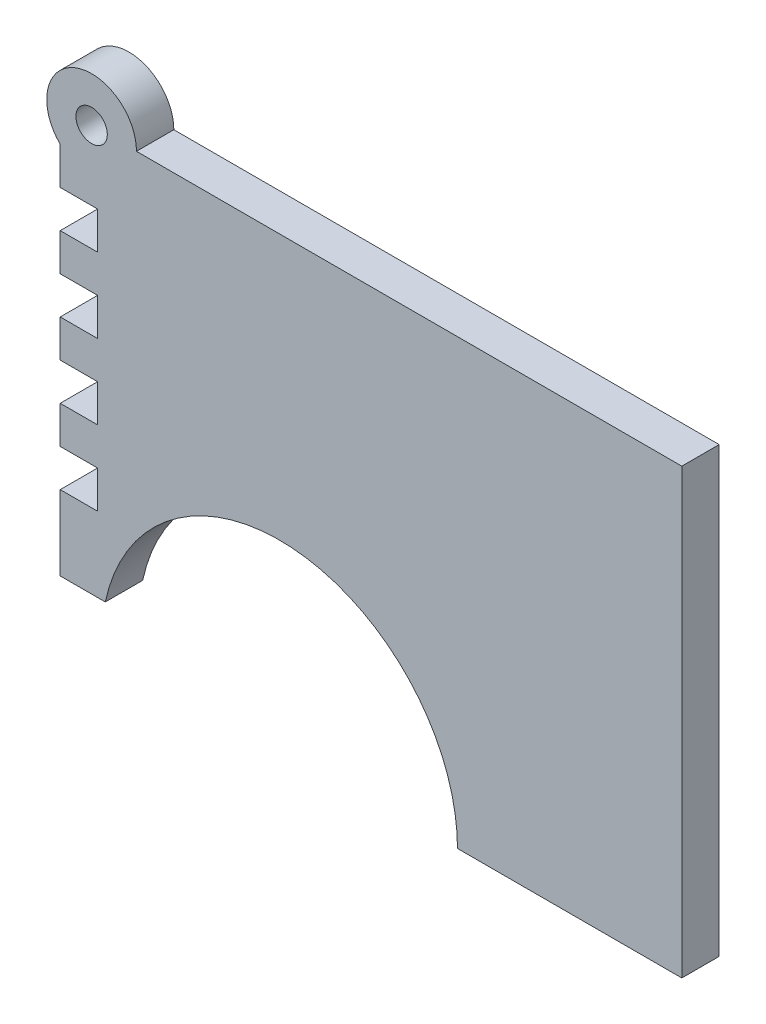
ISO-10303-21;
HEADER;
FILE_DESCRIPTION(('STEP AP214'),'2;1');
FILE_NAME('part.step','',(''),(''),'','','');
FILE_SCHEMA(('AUTOMOTIVE_DESIGN { 1 0 10303 214 1 1 1 1 }'));
ENDSEC;
DATA;
#1=APPLICATION_CONTEXT('core data for automotive mechanical design processes');
#2=APPLICATION_PROTOCOL_DEFINITION('international standard','automotive_design',2000,#1);
#3=PRODUCT_CONTEXT('',#1,'mechanical');
#4=PRODUCT('Part','Part','',(#3));
#5=PRODUCT_RELATED_PRODUCT_CATEGORY('part','',(#4));
#6=PRODUCT_DEFINITION_FORMATION('','',#4);
#7=PRODUCT_DEFINITION_CONTEXT('part definition',#1,'design');
#8=PRODUCT_DEFINITION('design','',#6,#7);
#9=PRODUCT_DEFINITION_SHAPE('','',#8);
#10=(LENGTH_UNIT() NAMED_UNIT(*) SI_UNIT(.MILLI.,.METRE.));
#11=(NAMED_UNIT(*) PLANE_ANGLE_UNIT() SI_UNIT($,.RADIAN.));
#12=(NAMED_UNIT(*) SI_UNIT($,.STERADIAN.) SOLID_ANGLE_UNIT());
#13=UNCERTAINTY_MEASURE_WITH_UNIT(LENGTH_MEASURE(1.E-05),#10,'distance_accuracy_value','');
#14=(GEOMETRIC_REPRESENTATION_CONTEXT(3) GLOBAL_UNCERTAINTY_ASSIGNED_CONTEXT((#13)) GLOBAL_UNIT_ASSIGNED_CONTEXT((#10,
#11,#12)) REPRESENTATION_CONTEXT('',''));
#15=CARTESIAN_POINT('',(0.,0.,0.));
#16=DIRECTION('',(0.,0.,1.));
#17=DIRECTION('',(1.,0.,0.));
#18=AXIS2_PLACEMENT_3D('',#15,#16,#17);
#19=CARTESIAN_POINT('',(-78.9358833827366,28.1282330178117,5.));
#20=DIRECTION('',(0.,0.,1.));
#21=DIRECTION('',(1.,0.,0.));
#22=AXIS2_PLACEMENT_3D('',#19,#20,#21);
#23=PLANE('',#22);
#24=CARTESIAN_POINT('',(-78.9358833827366,28.1282330178117,5.));
#25=DIRECTION('',(0.,0.,1.));
#26=DIRECTION('',(1.,0.,0.));
#27=AXIS2_PLACEMENT_3D('',#24,#25,#26);
#28=CIRCLE('',#27,5.99999999999999);
#29=CARTESIAN_POINT('',(-72.9358833827366,28.1282330178121,5.));
#30=VERTEX_POINT('',#29);
#31=CARTESIAN_POINT('',(-83.1358833827366,23.8433759606861,5.));
#32=VERTEX_POINT('',#31);
#33=EDGE_CURVE('E52',#30,#32,#28,.T.);
#34=ORIENTED_EDGE('',*,*,#33,.T.);
#35=DIRECTION('',(0.,-1.,0.));
#36=VECTOR('',#35,1.);
#37=CARTESIAN_POINT('',(-83.1358833827366,23.8433759606861,5.));
#38=LINE('',#37,#36);
#39=CARTESIAN_POINT('',(-83.1358833827366,18.842375860666,5.));
#40=VERTEX_POINT('',#39);
#41=EDGE_CURVE('E140',#32,#40,#38,.T.);
#42=ORIENTED_EDGE('',*,*,#41,.T.);
#43=DIRECTION('',(1.,0.,0.));
#44=VECTOR('',#43,1.);
#45=CARTESIAN_POINT('',(-78.1358833827366,18.842375860666,5.));
#46=LINE('',#45,#44);
#47=CARTESIAN_POINT('',(-78.1358833827366,18.842375860666,5.));
#48=VERTEX_POINT('',#47);
#49=EDGE_CURVE('E329',#40,#48,#46,.T.);
#50=ORIENTED_EDGE('',*,*,#49,.T.);
#51=DIRECTION('',(0.,-1.,0.));
#52=VECTOR('',#51,1.);
#53=CARTESIAN_POINT('',(-78.1358833827366,13.842375860666,5.));
#54=LINE('',#53,#52);
#55=CARTESIAN_POINT('',(-78.1358833827366,13.842375860666,5.));
#56=VERTEX_POINT('',#55);
#57=EDGE_CURVE('E349',#48,#56,#54,.T.);
#58=ORIENTED_EDGE('',*,*,#57,.T.);
#59=DIRECTION('',(-1.,0.,0.));
#60=VECTOR('',#59,1.);
#61=CARTESIAN_POINT('',(-83.1358833827367,13.842375860666,5.));
#62=LINE('',#61,#60);
#63=CARTESIAN_POINT('',(-83.1358833827367,13.842375860666,5.));
#64=VERTEX_POINT('',#63);
#65=EDGE_CURVE('E346',#56,#64,#62,.T.);
#66=ORIENTED_EDGE('',*,*,#65,.T.);
#67=DIRECTION('',(0.,-1.,0.));
#68=VECTOR('',#67,1.);
#69=CARTESIAN_POINT('',(-83.1358833827367,8.842375860666,5.));
#70=LINE('',#69,#68);
#71=CARTESIAN_POINT('',(-83.1358833827367,8.842375860666,5.));
#72=VERTEX_POINT('',#71);
#73=EDGE_CURVE('E348',#64,#72,#70,.T.);
#74=ORIENTED_EDGE('',*,*,#73,.T.);
#75=DIRECTION('',(1.,0.,0.));
#76=VECTOR('',#75,1.);
#77=CARTESIAN_POINT('',(-78.1358833827367,8.842375860666,5.));
#78=LINE('',#77,#76);
#79=CARTESIAN_POINT('',(-78.1358833827367,8.842375860666,5.));
#80=VERTEX_POINT('',#79);
#81=EDGE_CURVE('E351',#72,#80,#78,.T.);
#82=ORIENTED_EDGE('',*,*,#81,.T.);
#83=DIRECTION('',(0.,-1.,0.));
#84=VECTOR('',#83,1.);
#85=CARTESIAN_POINT('',(-78.1358833827367,3.842375860666,5.));
#86=LINE('',#85,#84);
#87=CARTESIAN_POINT('',(-78.1358833827367,3.842375860666,5.));
#88=VERTEX_POINT('',#87);
#89=EDGE_CURVE('E357',#80,#88,#86,.T.);
#90=ORIENTED_EDGE('',*,*,#89,.T.);
#91=DIRECTION('',(-1.,0.,0.));
#92=VECTOR('',#91,1.);
#93=CARTESIAN_POINT('',(-83.1358833827367,3.842375860666,5.));
#94=LINE('',#93,#92);
#95=CARTESIAN_POINT('',(-83.1358833827367,3.842375860666,5.));
#96=VERTEX_POINT('',#95);
#97=EDGE_CURVE('E359',#88,#96,#94,.T.);
#98=ORIENTED_EDGE('',*,*,#97,.T.);
#99=DIRECTION('',(0.,-1.,0.));
#100=VECTOR('',#99,1.);
#101=CARTESIAN_POINT('',(-83.1358833827367,-1.157624139334,5.));
#102=LINE('',#101,#100);
#103=CARTESIAN_POINT('',(-83.1358833827367,-1.157624139334,5.));
#104=VERTEX_POINT('',#103);
#105=EDGE_CURVE('E361',#96,#104,#102,.T.);
#106=ORIENTED_EDGE('',*,*,#105,.T.);
#107=DIRECTION('',(1.,0.,0.));
#108=VECTOR('',#107,1.);
#109=CARTESIAN_POINT('',(-78.1358833827367,-1.157624139334,5.));
#110=LINE('',#109,#108);
#111=CARTESIAN_POINT('',(-78.1358833827367,-1.157624139334,5.));
#112=VERTEX_POINT('',#111);
#113=EDGE_CURVE('E363',#104,#112,#110,.T.);
#114=ORIENTED_EDGE('',*,*,#113,.T.);
#115=DIRECTION('',(0.,-1.,0.));
#116=VECTOR('',#115,1.);
#117=CARTESIAN_POINT('',(-78.1358833827367,-1.157624139334,5.));
#118=LINE('',#117,#116);
#119=CARTESIAN_POINT('',(-78.1358833827367,-6.157624139334,5.));
#120=VERTEX_POINT('',#119);
#121=EDGE_CURVE('E365',#112,#120,#118,.T.);
#122=ORIENTED_EDGE('',*,*,#121,.T.);
#123=DIRECTION('',(-1.,0.,0.));
#124=VECTOR('',#123,1.);
#125=CARTESIAN_POINT('',(-83.1358833827367,-6.15762413933399,5.));
#126=LINE('',#125,#124);
#127=CARTESIAN_POINT('',(-83.1358833827367,-6.15762413933399,5.));
#128=VERTEX_POINT('',#127);
#129=EDGE_CURVE('E367',#120,#128,#126,.T.);
#130=ORIENTED_EDGE('',*,*,#129,.T.);
#131=DIRECTION('',(0.,-1.,0.));
#132=VECTOR('',#131,1.);
#133=CARTESIAN_POINT('',(-83.1358833827367,-6.15762413933399,5.));
#134=LINE('',#133,#132);
#135=CARTESIAN_POINT('',(-83.1358833827366,-11.157624139334,5.));
#136=VERTEX_POINT('',#135);
#137=EDGE_CURVE('E369',#128,#136,#134,.T.);
#138=ORIENTED_EDGE('',*,*,#137,.T.);
#139=DIRECTION('',(1.,0.,0.));
#140=VECTOR('',#139,1.);
#141=CARTESIAN_POINT('',(-83.1358833827366,-11.157624139334,5.));
#142=LINE('',#141,#140);
#143=CARTESIAN_POINT('',(-78.1358833827366,-11.157624139334,5.));
#144=VERTEX_POINT('',#143);
#145=EDGE_CURVE('E371',#136,#144,#142,.T.);
#146=ORIENTED_EDGE('',*,*,#145,.T.);
#147=DIRECTION('',(0.,-1.,0.));
#148=VECTOR('',#147,1.);
#149=CARTESIAN_POINT('',(-78.1358833827366,-11.157624139334,5.));
#150=LINE('',#149,#148);
#151=CARTESIAN_POINT('',(-78.1358833827366,-16.157624139334,5.));
#152=VERTEX_POINT('',#151);
#153=EDGE_CURVE('E373',#144,#152,#150,.T.);
#154=ORIENTED_EDGE('',*,*,#153,.T.);
#155=DIRECTION('',(-1.,0.,0.));
#156=VECTOR('',#155,1.);
#157=CARTESIAN_POINT('',(-78.1358833827366,-16.157624139334,5.));
#158=LINE('',#157,#156);
#159=CARTESIAN_POINT('',(-83.1358833827366,-16.157624139334,5.));
#160=VERTEX_POINT('',#159);
#161=EDGE_CURVE('E375',#152,#160,#158,.T.);
#162=ORIENTED_EDGE('',*,*,#161,.T.);
#163=DIRECTION('',(0.,-1.,0.));
#164=VECTOR('',#163,1.);
#165=CARTESIAN_POINT('',(-83.1358833827366,-16.157624139334,5.));
#166=LINE('',#165,#164);
#167=CARTESIAN_POINT('',(-83.1358833827366,-26.1576241393341,5.));
#168=VERTEX_POINT('',#167);
#169=EDGE_CURVE('E377',#160,#168,#166,.T.);
#170=ORIENTED_EDGE('',*,*,#169,.T.);
#171=DIRECTION('',(1.,0.,0.));
#172=VECTOR('',#171,1.);
#173=CARTESIAN_POINT('',(-77.1051559174905,-26.1576241393341,5.));
#174=LINE('',#173,#172);
#175=CARTESIAN_POINT('',(-77.1051559174905,-26.1576241393341,5.));
#176=VERTEX_POINT('',#175);
#177=EDGE_CURVE('E379',#168,#176,#174,.T.);
#178=ORIENTED_EDGE('',*,*,#177,.T.);
#179=CARTESIAN_POINT('',(-53.8179416913671,-31.157624139334,5.));
#180=DIRECTION('',(0.,0.,-1.));
#181=DIRECTION('',(1.,0.,0.));
#182=AXIS2_PLACEMENT_3D('',#179,#180,#181);
#183=CIRCLE('',#182,23.8179416913671);
#184=CARTESIAN_POINT('',(-30.,-31.157624139334,5.));
#185=VERTEX_POINT('',#184);
#186=EDGE_CURVE('E205',#176,#185,#183,.T.);
#187=ORIENTED_EDGE('',*,*,#186,.T.);
#188=DIRECTION('',(1.,0.,0.));
#189=VECTOR('',#188,1.);
#190=CARTESIAN_POINT('',(0.,-31.157624139334,5.));
#191=LINE('',#190,#189);
#192=CARTESIAN_POINT('',(0.,-31.157624139334,5.));
#193=VERTEX_POINT('',#192);
#194=EDGE_CURVE('E199',#185,#193,#191,.T.);
#195=ORIENTED_EDGE('',*,*,#194,.T.);
#196=DIRECTION('',(0.,1.,0.));
#197=VECTOR('',#196,1.);
#198=CARTESIAN_POINT('',(0.,13.842375860666,5.));
#199=LINE('',#198,#197);
#200=CARTESIAN_POINT('',(0.,28.128233017812,5.));
#201=VERTEX_POINT('',#200);
#202=EDGE_CURVE('E203',#193,#201,#199,.T.);
#203=ORIENTED_EDGE('',*,*,#202,.T.);
#204=DIRECTION('',(-1.,0.,0.));
#205=VECTOR('',#204,1.);
#206=CARTESIAN_POINT('',(0.,28.128233017812,5.));
#207=LINE('',#206,#205);
#208=EDGE_CURVE('E220',#201,#30,#207,.T.);
#209=ORIENTED_EDGE('',*,*,#208,.T.);
#210=EDGE_LOOP('',(#34,#42,#50,#58,#66,#74,#82,#90,#98,#106,#114,#122,#130,#138,#146,#154,#162,
#170,#178,#187,#195,#203,#209));
#211=FACE_BOUND('',#210,.T.);
#212=CARTESIAN_POINT('',(-78.9358833827366,28.1282330178117,5.));
#213=DIRECTION('',(0.,0.,1.));
#214=DIRECTION('',(1.,0.,0.));
#215=AXIS2_PLACEMENT_3D('',#212,#213,#214);
#216=CIRCLE('',#215,2.09999999999999);
#217=CARTESIAN_POINT('',(-76.8358833827366,28.1282330178117,5.));
#218=VERTEX_POINT('',#217);
#219=EDGE_CURVE('E229',#218,#218,#216,.T.);
#220=ORIENTED_EDGE('',*,*,#219,.F.);
#221=EDGE_LOOP('',(#220));
#222=FACE_BOUND('',#221,.T.);
#223=ADVANCED_FACE('F35',(#211,#222),#23,.T.);
#224=CARTESIAN_POINT('',(-78.9358833827366,28.1282330178117,0.));
#225=DIRECTION('',(0.,0.,1.));
#226=DIRECTION('',(1.,0.,0.));
#227=AXIS2_PLACEMENT_3D('',#224,#225,#226);
#228=PLANE('',#227);
#229=DIRECTION('',(0.,-1.,0.));
#230=VECTOR('',#229,1.);
#231=CARTESIAN_POINT('',(-83.1358833827366,23.8433759606861,0.));
#232=LINE('',#231,#230);
#233=CARTESIAN_POINT('',(-83.1358833827366,23.8433759606861,0.));
#234=VERTEX_POINT('',#233);
#235=CARTESIAN_POINT('',(-83.1358833827366,18.842375860666,0.));
#236=VERTEX_POINT('',#235);
#237=EDGE_CURVE('E226',#234,#236,#232,.T.);
#238=ORIENTED_EDGE('',*,*,#237,.F.);
#239=CARTESIAN_POINT('',(-78.9358833827366,28.1282330178117,0.));
#240=DIRECTION('',(0.,0.,1.));
#241=DIRECTION('',(1.,0.,0.));
#242=AXIS2_PLACEMENT_3D('',#239,#240,#241);
#243=CIRCLE('',#242,6.);
#244=CARTESIAN_POINT('',(-72.9358833827366,28.1282330178121,0.));
#245=VERTEX_POINT('',#244);
#246=EDGE_CURVE('E268',#245,#234,#243,.T.);
#247=ORIENTED_EDGE('',*,*,#246,.F.);
#248=DIRECTION('',(-1.,0.,0.));
#249=VECTOR('',#248,1.);
#250=CARTESIAN_POINT('',(0.,28.128233017812,0.));
#251=LINE('',#250,#249);
#252=CARTESIAN_POINT('',(0.,28.128233017812,0.));
#253=VERTEX_POINT('',#252);
#254=EDGE_CURVE('E133',#253,#245,#251,.T.);
#255=ORIENTED_EDGE('',*,*,#254,.F.);
#256=DIRECTION('',(0.,1.,0.));
#257=VECTOR('',#256,1.);
#258=CARTESIAN_POINT('',(0.,13.842375860666,0.));
#259=LINE('',#258,#257);
#260=CARTESIAN_POINT('',(0.,-31.157624139334,0.));
#261=VERTEX_POINT('',#260);
#262=EDGE_CURVE('E126',#261,#253,#259,.T.);
#263=ORIENTED_EDGE('',*,*,#262,.F.);
#264=DIRECTION('',(1.,0.,0.));
#265=VECTOR('',#264,1.);
#266=CARTESIAN_POINT('',(0.,-31.157624139334,0.));
#267=LINE('',#266,#265);
#268=CARTESIAN_POINT('',(-30.,-31.157624139334,0.));
#269=VERTEX_POINT('',#268);
#270=EDGE_CURVE('E214',#269,#261,#267,.T.);
#271=ORIENTED_EDGE('',*,*,#270,.F.);
#272=CARTESIAN_POINT('',(-53.8179416913671,-31.157624139334,0.));
#273=DIRECTION('',(0.,0.,-1.));
#274=DIRECTION('',(1.,0.,0.));
#275=AXIS2_PLACEMENT_3D('',#272,#273,#274);
#276=CIRCLE('',#275,23.8179416913671);
#277=CARTESIAN_POINT('',(-77.1051559174905,-26.1576241393341,0.));
#278=VERTEX_POINT('',#277);
#279=EDGE_CURVE('E263',#278,#269,#276,.T.);
#280=ORIENTED_EDGE('',*,*,#279,.F.);
#281=DIRECTION('',(1.,0.,0.));
#282=VECTOR('',#281,1.);
#283=CARTESIAN_POINT('',(-77.1051559174905,-26.1576241393341,0.));
#284=LINE('',#283,#282);
#285=CARTESIAN_POINT('',(-83.1358833827366,-26.1576241393341,0.));
#286=VERTEX_POINT('',#285);
#287=EDGE_CURVE('E261',#286,#278,#284,.T.);
#288=ORIENTED_EDGE('',*,*,#287,.F.);
#289=DIRECTION('',(0.,-1.,0.));
#290=VECTOR('',#289,1.);
#291=CARTESIAN_POINT('',(-83.1358833827366,-16.157624139334,0.));
#292=LINE('',#291,#290);
#293=CARTESIAN_POINT('',(-83.1358833827366,-16.157624139334,0.));
#294=VERTEX_POINT('',#293);
#295=EDGE_CURVE('E259',#294,#286,#292,.T.);
#296=ORIENTED_EDGE('',*,*,#295,.F.);
#297=DIRECTION('',(-1.,0.,0.));
#298=VECTOR('',#297,1.);
#299=CARTESIAN_POINT('',(-78.1358833827366,-16.157624139334,0.));
#300=LINE('',#299,#298);
#301=CARTESIAN_POINT('',(-78.1358833827366,-16.157624139334,0.));
#302=VERTEX_POINT('',#301);
#303=EDGE_CURVE('E257',#302,#294,#300,.T.);
#304=ORIENTED_EDGE('',*,*,#303,.F.);
#305=DIRECTION('',(0.,-1.,0.));
#306=VECTOR('',#305,1.);
#307=CARTESIAN_POINT('',(-78.1358833827366,-11.157624139334,0.));
#308=LINE('',#307,#306);
#309=CARTESIAN_POINT('',(-78.1358833827366,-11.157624139334,0.));
#310=VERTEX_POINT('',#309);
#311=EDGE_CURVE('E255',#310,#302,#308,.T.);
#312=ORIENTED_EDGE('',*,*,#311,.F.);
#313=DIRECTION('',(1.,0.,0.));
#314=VECTOR('',#313,1.);
#315=CARTESIAN_POINT('',(-83.1358833827366,-11.157624139334,0.));
#316=LINE('',#315,#314);
#317=CARTESIAN_POINT('',(-83.1358833827366,-11.157624139334,0.));
#318=VERTEX_POINT('',#317);
#319=EDGE_CURVE('E253',#318,#310,#316,.T.);
#320=ORIENTED_EDGE('',*,*,#319,.F.);
#321=DIRECTION('',(0.,-1.,0.));
#322=VECTOR('',#321,1.);
#323=CARTESIAN_POINT('',(-83.1358833827367,-6.15762413933399,0.));
#324=LINE('',#323,#322);
#325=CARTESIAN_POINT('',(-83.1358833827367,-6.15762413933399,0.));
#326=VERTEX_POINT('',#325);
#327=EDGE_CURVE('E251',#326,#318,#324,.T.);
#328=ORIENTED_EDGE('',*,*,#327,.F.);
#329=DIRECTION('',(-1.,0.,0.));
#330=VECTOR('',#329,1.);
#331=CARTESIAN_POINT('',(-83.1358833827367,-6.15762413933399,0.));
#332=LINE('',#331,#330);
#333=CARTESIAN_POINT('',(-78.1358833827367,-6.157624139334,0.));
#334=VERTEX_POINT('',#333);
#335=EDGE_CURVE('E249',#334,#326,#332,.T.);
#336=ORIENTED_EDGE('',*,*,#335,.F.);
#337=DIRECTION('',(0.,-1.,0.));
#338=VECTOR('',#337,1.);
#339=CARTESIAN_POINT('',(-78.1358833827367,-1.157624139334,0.));
#340=LINE('',#339,#338);
#341=CARTESIAN_POINT('',(-78.1358833827367,-1.157624139334,0.));
#342=VERTEX_POINT('',#341);
#343=EDGE_CURVE('E247',#342,#334,#340,.T.);
#344=ORIENTED_EDGE('',*,*,#343,.F.);
#345=DIRECTION('',(1.,0.,0.));
#346=VECTOR('',#345,1.);
#347=CARTESIAN_POINT('',(-78.1358833827367,-1.157624139334,0.));
#348=LINE('',#347,#346);
#349=CARTESIAN_POINT('',(-83.1358833827367,-1.157624139334,0.));
#350=VERTEX_POINT('',#349);
#351=EDGE_CURVE('E245',#350,#342,#348,.T.);
#352=ORIENTED_EDGE('',*,*,#351,.F.);
#353=DIRECTION('',(0.,-1.,0.));
#354=VECTOR('',#353,1.);
#355=CARTESIAN_POINT('',(-83.1358833827367,-1.157624139334,0.));
#356=LINE('',#355,#354);
#357=CARTESIAN_POINT('',(-83.1358833827367,3.842375860666,0.));
#358=VERTEX_POINT('',#357);
#359=EDGE_CURVE('E243',#358,#350,#356,.T.);
#360=ORIENTED_EDGE('',*,*,#359,.F.);
#361=DIRECTION('',(-1.,0.,0.));
#362=VECTOR('',#361,1.);
#363=CARTESIAN_POINT('',(-83.1358833827367,3.842375860666,0.));
#364=LINE('',#363,#362);
#365=CARTESIAN_POINT('',(-78.1358833827367,3.842375860666,0.));
#366=VERTEX_POINT('',#365);
#367=EDGE_CURVE('E241',#366,#358,#364,.T.);
#368=ORIENTED_EDGE('',*,*,#367,.F.);
#369=DIRECTION('',(0.,-1.,0.));
#370=VECTOR('',#369,1.);
#371=CARTESIAN_POINT('',(-78.1358833827367,3.842375860666,0.));
#372=LINE('',#371,#370);
#373=CARTESIAN_POINT('',(-78.1358833827367,8.842375860666,0.));
#374=VERTEX_POINT('',#373);
#375=EDGE_CURVE('E239',#374,#366,#372,.T.);
#376=ORIENTED_EDGE('',*,*,#375,.F.);
#377=DIRECTION('',(1.,0.,0.));
#378=VECTOR('',#377,1.);
#379=CARTESIAN_POINT('',(-78.1358833827367,8.842375860666,0.));
#380=LINE('',#379,#378);
#381=CARTESIAN_POINT('',(-83.1358833827367,8.842375860666,0.));
#382=VERTEX_POINT('',#381);
#383=EDGE_CURVE('E237',#382,#374,#380,.T.);
#384=ORIENTED_EDGE('',*,*,#383,.F.);
#385=DIRECTION('',(0.,-1.,0.));
#386=VECTOR('',#385,1.);
#387=CARTESIAN_POINT('',(-83.1358833827367,8.842375860666,0.));
#388=LINE('',#387,#386);
#389=CARTESIAN_POINT('',(-83.1358833827367,13.842375860666,0.));
#390=VERTEX_POINT('',#389);
#391=EDGE_CURVE('E235',#390,#382,#388,.T.);
#392=ORIENTED_EDGE('',*,*,#391,.F.);
#393=DIRECTION('',(-1.,0.,0.));
#394=VECTOR('',#393,1.);
#395=CARTESIAN_POINT('',(-83.1358833827367,13.842375860666,0.));
#396=LINE('',#395,#394);
#397=CARTESIAN_POINT('',(-78.1358833827366,13.842375860666,0.));
#398=VERTEX_POINT('',#397);
#399=EDGE_CURVE('E233',#398,#390,#396,.T.);
#400=ORIENTED_EDGE('',*,*,#399,.F.);
#401=DIRECTION('',(0.,-1.,0.));
#402=VECTOR('',#401,1.);
#403=CARTESIAN_POINT('',(-78.1358833827366,13.842375860666,0.));
#404=LINE('',#403,#402);
#405=CARTESIAN_POINT('',(-78.1358833827366,18.842375860666,0.));
#406=VERTEX_POINT('',#405);
#407=EDGE_CURVE('E231',#406,#398,#404,.T.);
#408=ORIENTED_EDGE('',*,*,#407,.F.);
#409=DIRECTION('',(1.,0.,0.));
#410=VECTOR('',#409,1.);
#411=CARTESIAN_POINT('',(-78.1358833827366,18.842375860666,0.));
#412=LINE('',#411,#410);
#413=EDGE_CURVE('E228',#236,#406,#412,.T.);
#414=ORIENTED_EDGE('',*,*,#413,.F.);
#415=EDGE_LOOP('',(#238,#247,#255,#263,#271,#280,#288,#296,#304,#312,#320,#328,#336,#344,#352,
#360,#368,#376,#384,#392,#400,#408,#414));
#416=FACE_BOUND('',#415,.T.);
#417=CARTESIAN_POINT('',(-78.9358833827366,28.1282330178117,0.));
#418=DIRECTION('',(0.,0.,1.));
#419=DIRECTION('',(1.,0.,0.));
#420=AXIS2_PLACEMENT_3D('',#417,#418,#419);
#421=CIRCLE('',#420,2.09999999999999);
#422=CARTESIAN_POINT('',(-76.8358833827366,28.1282330178117,0.));
#423=VERTEX_POINT('',#422);
#424=EDGE_CURVE('E395',#423,#423,#421,.T.);
#425=ORIENTED_EDGE('',*,*,#424,.T.);
#426=EDGE_LOOP('',(#425));
#427=FACE_BOUND('',#426,.T.);
#428=ADVANCED_FACE('F333',(#416,#427),#228,.F.);
#429=CARTESIAN_POINT('',(-83.1358833827366,23.8433759606861,5.));
#430=DIRECTION('',(1.,0.,0.));
#431=DIRECTION('',(0.,0.,-1.));
#432=AXIS2_PLACEMENT_3D('',#429,#430,#431);
#433=PLANE('',#432);
#434=ORIENTED_EDGE('',*,*,#237,.T.);
#435=DIRECTION('',(0.,0.,-1.));
#436=VECTOR('',#435,1.);
#437=CARTESIAN_POINT('',(-83.1358833827366,18.842375860666,5.));
#438=LINE('',#437,#436);
#439=EDGE_CURVE('E44',#40,#236,#438,.T.);
#440=ORIENTED_EDGE('',*,*,#439,.F.);
#441=ORIENTED_EDGE('',*,*,#41,.F.);
#442=DIRECTION('',(0.,0.,-1.));
#443=VECTOR('',#442,1.);
#444=CARTESIAN_POINT('',(-83.1358833827366,23.8433759606861,5.));
#445=LINE('',#444,#443);
#446=EDGE_CURVE('E11',#32,#234,#445,.T.);
#447=ORIENTED_EDGE('',*,*,#446,.T.);
#448=EDGE_LOOP('',(#434,#440,#441,#447));
#449=FACE_BOUND('',#448,.T.);
#450=ADVANCED_FACE('F37',(#449),#433,.F.);
#451=CARTESIAN_POINT('',(-78.1358833827366,18.842375860666,5.));
#452=DIRECTION('',(0.,1.,0.));
#453=DIRECTION('',(0.,0.,1.));
#454=AXIS2_PLACEMENT_3D('',#451,#452,#453);
#455=PLANE('',#454);
#456=ORIENTED_EDGE('',*,*,#413,.T.);
#457=DIRECTION('',(0.,0.,-1.));
#458=VECTOR('',#457,1.);
#459=CARTESIAN_POINT('',(-78.1358833827366,18.842375860666,5.));
#460=LINE('',#459,#458);
#461=EDGE_CURVE('E321',#48,#406,#460,.T.);
#462=ORIENTED_EDGE('',*,*,#461,.F.);
#463=ORIENTED_EDGE('',*,*,#49,.F.);
#464=ORIENTED_EDGE('',*,*,#439,.T.);
#465=EDGE_LOOP('',(#456,#462,#463,#464));
#466=FACE_BOUND('',#465,.T.);
#467=ADVANCED_FACE('F327',(#466),#455,.F.);
#468=CARTESIAN_POINT('',(-78.1358833827366,13.842375860666,5.));
#469=DIRECTION('',(1.,0.,0.));
#470=DIRECTION('',(0.,0.,-1.));
#471=AXIS2_PLACEMENT_3D('',#468,#469,#470);
#472=PLANE('',#471);
#473=ORIENTED_EDGE('',*,*,#407,.T.);
#474=DIRECTION('',(0.,0.,-1.));
#475=VECTOR('',#474,1.);
#476=CARTESIAN_POINT('',(-78.1358833827366,13.842375860666,5.));
#477=LINE('',#476,#475);
#478=EDGE_CURVE('E318',#56,#398,#477,.T.);
#479=ORIENTED_EDGE('',*,*,#478,.F.);
#480=ORIENTED_EDGE('',*,*,#57,.F.);
#481=ORIENTED_EDGE('',*,*,#461,.T.);
#482=EDGE_LOOP('',(#473,#479,#480,#481));
#483=FACE_BOUND('',#482,.T.);
#484=ADVANCED_FACE('F340',(#483),#472,.F.);
#485=CARTESIAN_POINT('',(-83.1358833827367,13.842375860666,5.));
#486=DIRECTION('',(0.,-1.,0.));
#487=DIRECTION('',(1.,0.,0.));
#488=AXIS2_PLACEMENT_3D('',#485,#486,#487);
#489=PLANE('',#488);
#490=ORIENTED_EDGE('',*,*,#399,.T.);
#491=DIRECTION('',(0.,0.,-1.));
#492=VECTOR('',#491,1.);
#493=CARTESIAN_POINT('',(-83.1358833827367,13.842375860666,5.));
#494=LINE('',#493,#492);
#495=EDGE_CURVE('E315',#64,#390,#494,.T.);
#496=ORIENTED_EDGE('',*,*,#495,.F.);
#497=ORIENTED_EDGE('',*,*,#65,.F.);
#498=ORIENTED_EDGE('',*,*,#478,.T.);
#499=EDGE_LOOP('',(#490,#496,#497,#498));
#500=FACE_BOUND('',#499,.T.);
#501=ADVANCED_FACE('F344',(#500),#489,.F.);
#502=CARTESIAN_POINT('',(-83.1358833827367,8.842375860666,5.));
#503=DIRECTION('',(1.,0.,0.));
#504=DIRECTION('',(0.,0.,-1.));
#505=AXIS2_PLACEMENT_3D('',#502,#503,#504);
#506=PLANE('',#505);
#507=ORIENTED_EDGE('',*,*,#391,.T.);
#508=DIRECTION('',(0.,0.,-1.));
#509=VECTOR('',#508,1.);
#510=CARTESIAN_POINT('',(-83.1358833827367,8.842375860666,5.));
#511=LINE('',#510,#509);
#512=EDGE_CURVE('E312',#72,#382,#511,.T.);
#513=ORIENTED_EDGE('',*,*,#512,.F.);
#514=ORIENTED_EDGE('',*,*,#73,.F.);
#515=ORIENTED_EDGE('',*,*,#495,.T.);
#516=EDGE_LOOP('',(#507,#513,#514,#515));
#517=FACE_BOUND('',#516,.T.);
#518=ADVANCED_FACE('F470',(#517),#506,.F.);
#519=CARTESIAN_POINT('',(-78.1358833827367,8.842375860666,5.));
#520=DIRECTION('',(0.,1.,0.));
#521=DIRECTION('',(-1.,0.,0.));
#522=AXIS2_PLACEMENT_3D('',#519,#520,#521);
#523=PLANE('',#522);
#524=ORIENTED_EDGE('',*,*,#383,.T.);
#525=DIRECTION('',(0.,0.,-1.));
#526=VECTOR('',#525,1.);
#527=CARTESIAN_POINT('',(-78.1358833827367,8.842375860666,5.));
#528=LINE('',#527,#526);
#529=EDGE_CURVE('E309',#80,#374,#528,.T.);
#530=ORIENTED_EDGE('',*,*,#529,.F.);
#531=ORIENTED_EDGE('',*,*,#81,.F.);
#532=ORIENTED_EDGE('',*,*,#512,.T.);
#533=EDGE_LOOP('',(#524,#530,#531,#532));
#534=FACE_BOUND('',#533,.T.);
#535=ADVANCED_FACE('F466',(#534),#523,.F.);
#536=CARTESIAN_POINT('',(-78.1358833827367,3.842375860666,5.));
#537=DIRECTION('',(1.,0.,0.));
#538=DIRECTION('',(0.,1.,0.));
#539=AXIS2_PLACEMENT_3D('',#536,#537,#538);
#540=PLANE('',#539);
#541=ORIENTED_EDGE('',*,*,#375,.T.);
#542=DIRECTION('',(0.,0.,-1.));
#543=VECTOR('',#542,1.);
#544=CARTESIAN_POINT('',(-78.1358833827367,3.842375860666,5.));
#545=LINE('',#544,#543);
#546=EDGE_CURVE('E306',#88,#366,#545,.T.);
#547=ORIENTED_EDGE('',*,*,#546,.F.);
#548=ORIENTED_EDGE('',*,*,#89,.F.);
#549=ORIENTED_EDGE('',*,*,#529,.T.);
#550=EDGE_LOOP('',(#541,#547,#548,#549));
#551=FACE_BOUND('',#550,.T.);
#552=ADVANCED_FACE('F462',(#551),#540,.F.);
#553=CARTESIAN_POINT('',(-83.1358833827367,3.842375860666,5.));
#554=DIRECTION('',(0.,-1.,0.));
#555=DIRECTION('',(1.,0.,0.));
#556=AXIS2_PLACEMENT_3D('',#553,#554,#555);
#557=PLANE('',#556);
#558=ORIENTED_EDGE('',*,*,#367,.T.);
#559=DIRECTION('',(0.,0.,-1.));
#560=VECTOR('',#559,1.);
#561=CARTESIAN_POINT('',(-83.1358833827367,3.842375860666,5.));
#562=LINE('',#561,#560);
#563=EDGE_CURVE('E303',#96,#358,#562,.T.);
#564=ORIENTED_EDGE('',*,*,#563,.F.);
#565=ORIENTED_EDGE('',*,*,#97,.F.);
#566=ORIENTED_EDGE('',*,*,#546,.T.);
#567=EDGE_LOOP('',(#558,#564,#565,#566));
#568=FACE_BOUND('',#567,.T.);
#569=ADVANCED_FACE('F458',(#568),#557,.F.);
#570=CARTESIAN_POINT('',(-83.1358833827367,-1.157624139334,5.));
#571=DIRECTION('',(1.,0.,0.));
#572=DIRECTION('',(0.,0.,-1.));
#573=AXIS2_PLACEMENT_3D('',#570,#571,#572);
#574=PLANE('',#573);
#575=ORIENTED_EDGE('',*,*,#359,.T.);
#576=DIRECTION('',(0.,0.,-1.));
#577=VECTOR('',#576,1.);
#578=CARTESIAN_POINT('',(-83.1358833827367,-1.157624139334,5.));
#579=LINE('',#578,#577);
#580=EDGE_CURVE('E300',#104,#350,#579,.T.);
#581=ORIENTED_EDGE('',*,*,#580,.F.);
#582=ORIENTED_EDGE('',*,*,#105,.F.);
#583=ORIENTED_EDGE('',*,*,#563,.T.);
#584=EDGE_LOOP('',(#575,#581,#582,#583));
#585=FACE_BOUND('',#584,.T.);
#586=ADVANCED_FACE('F454',(#585),#574,.F.);
#587=CARTESIAN_POINT('',(-78.1358833827367,-1.157624139334,5.));
#588=DIRECTION('',(0.,1.,0.));
#589=DIRECTION('',(-1.,0.,0.));
#590=AXIS2_PLACEMENT_3D('',#587,#588,#589);
#591=PLANE('',#590);
#592=ORIENTED_EDGE('',*,*,#351,.T.);
#593=DIRECTION('',(0.,0.,-1.));
#594=VECTOR('',#593,1.);
#595=CARTESIAN_POINT('',(-78.1358833827367,-1.157624139334,5.));
#596=LINE('',#595,#594);
#597=EDGE_CURVE('E297',#112,#342,#596,.T.);
#598=ORIENTED_EDGE('',*,*,#597,.F.);
#599=ORIENTED_EDGE('',*,*,#113,.F.);
#600=ORIENTED_EDGE('',*,*,#580,.T.);
#601=EDGE_LOOP('',(#592,#598,#599,#600));
#602=FACE_BOUND('',#601,.T.);
#603=ADVANCED_FACE('F450',(#602),#591,.F.);
#604=CARTESIAN_POINT('',(-78.1358833827367,-1.157624139334,5.));
#605=DIRECTION('',(1.,0.,0.));
#606=DIRECTION('',(0.,0.,-1.));
#607=AXIS2_PLACEMENT_3D('',#604,#605,#606);
#608=PLANE('',#607);
#609=ORIENTED_EDGE('',*,*,#343,.T.);
#610=DIRECTION('',(0.,0.,-1.));
#611=VECTOR('',#610,1.);
#612=CARTESIAN_POINT('',(-78.1358833827367,-6.157624139334,5.));
#613=LINE('',#612,#611);
#614=EDGE_CURVE('E294',#120,#334,#613,.T.);
#615=ORIENTED_EDGE('',*,*,#614,.F.);
#616=ORIENTED_EDGE('',*,*,#121,.F.);
#617=ORIENTED_EDGE('',*,*,#597,.T.);
#618=EDGE_LOOP('',(#609,#615,#616,#617));
#619=FACE_BOUND('',#618,.T.);
#620=ADVANCED_FACE('F446',(#619),#608,.F.);
#621=CARTESIAN_POINT('',(-83.1358833827367,-6.15762413933399,5.));
#622=DIRECTION('',(0.,-1.,0.));
#623=DIRECTION('',(1.,0.,0.));
#624=AXIS2_PLACEMENT_3D('',#621,#622,#623);
#625=PLANE('',#624);
#626=ORIENTED_EDGE('',*,*,#335,.T.);
#627=DIRECTION('',(0.,0.,-1.));
#628=VECTOR('',#627,1.);
#629=CARTESIAN_POINT('',(-83.1358833827367,-6.15762413933399,5.));
#630=LINE('',#629,#628);
#631=EDGE_CURVE('E291',#128,#326,#630,.T.);
#632=ORIENTED_EDGE('',*,*,#631,.F.);
#633=ORIENTED_EDGE('',*,*,#129,.F.);
#634=ORIENTED_EDGE('',*,*,#614,.T.);
#635=EDGE_LOOP('',(#626,#632,#633,#634));
#636=FACE_BOUND('',#635,.T.);
#637=ADVANCED_FACE('F442',(#636),#625,.F.);
#638=CARTESIAN_POINT('',(-83.1358833827367,-6.15762413933399,5.));
#639=DIRECTION('',(1.,0.,0.));
#640=DIRECTION('',(0.,1.,0.));
#641=AXIS2_PLACEMENT_3D('',#638,#639,#640);
#642=PLANE('',#641);
#643=ORIENTED_EDGE('',*,*,#327,.T.);
#644=DIRECTION('',(0.,0.,-1.));
#645=VECTOR('',#644,1.);
#646=CARTESIAN_POINT('',(-83.1358833827366,-11.157624139334,5.));
#647=LINE('',#646,#645);
#648=EDGE_CURVE('E288',#136,#318,#647,.T.);
#649=ORIENTED_EDGE('',*,*,#648,.F.);
#650=ORIENTED_EDGE('',*,*,#137,.F.);
#651=ORIENTED_EDGE('',*,*,#631,.T.);
#652=EDGE_LOOP('',(#643,#649,#650,#651));
#653=FACE_BOUND('',#652,.T.);
#654=ADVANCED_FACE('F438',(#653),#642,.F.);
#655=CARTESIAN_POINT('',(-83.1358833827366,-11.157624139334,5.));
#656=DIRECTION('',(0.,1.,0.));
#657=DIRECTION('',(-1.,0.,0.));
#658=AXIS2_PLACEMENT_3D('',#655,#656,#657);
#659=PLANE('',#658);
#660=ORIENTED_EDGE('',*,*,#319,.T.);
#661=DIRECTION('',(0.,0.,-1.));
#662=VECTOR('',#661,1.);
#663=CARTESIAN_POINT('',(-78.1358833827366,-11.157624139334,5.));
#664=LINE('',#663,#662);
#665=EDGE_CURVE('E285',#144,#310,#664,.T.);
#666=ORIENTED_EDGE('',*,*,#665,.F.);
#667=ORIENTED_EDGE('',*,*,#145,.F.);
#668=ORIENTED_EDGE('',*,*,#648,.T.);
#669=EDGE_LOOP('',(#660,#666,#667,#668));
#670=FACE_BOUND('',#669,.T.);
#671=ADVANCED_FACE('F434',(#670),#659,.F.);
#672=CARTESIAN_POINT('',(-78.1358833827366,-11.157624139334,5.));
#673=DIRECTION('',(1.,0.,0.));
#674=DIRECTION('',(0.,0.,-1.));
#675=AXIS2_PLACEMENT_3D('',#672,#673,#674);
#676=PLANE('',#675);
#677=ORIENTED_EDGE('',*,*,#311,.T.);
#678=DIRECTION('',(0.,0.,-1.));
#679=VECTOR('',#678,1.);
#680=CARTESIAN_POINT('',(-78.1358833827366,-16.157624139334,5.));
#681=LINE('',#680,#679);
#682=EDGE_CURVE('E282',#152,#302,#681,.T.);
#683=ORIENTED_EDGE('',*,*,#682,.F.);
#684=ORIENTED_EDGE('',*,*,#153,.F.);
#685=ORIENTED_EDGE('',*,*,#665,.T.);
#686=EDGE_LOOP('',(#677,#683,#684,#685));
#687=FACE_BOUND('',#686,.T.);
#688=ADVANCED_FACE('F430',(#687),#676,.F.);
#689=CARTESIAN_POINT('',(-78.1358833827366,-16.157624139334,5.));
#690=DIRECTION('',(0.,-1.,0.));
#691=DIRECTION('',(0.,0.,-1.));
#692=AXIS2_PLACEMENT_3D('',#689,#690,#691);
#693=PLANE('',#692);
#694=ORIENTED_EDGE('',*,*,#303,.T.);
#695=DIRECTION('',(0.,0.,-1.));
#696=VECTOR('',#695,1.);
#697=CARTESIAN_POINT('',(-83.1358833827366,-16.157624139334,5.));
#698=LINE('',#697,#696);
#699=EDGE_CURVE('E279',#160,#294,#698,.T.);
#700=ORIENTED_EDGE('',*,*,#699,.F.);
#701=ORIENTED_EDGE('',*,*,#161,.F.);
#702=ORIENTED_EDGE('',*,*,#682,.T.);
#703=EDGE_LOOP('',(#694,#700,#701,#702));
#704=FACE_BOUND('',#703,.T.);
#705=ADVANCED_FACE('F426',(#704),#693,.F.);
#706=CARTESIAN_POINT('',(-83.1358833827366,-16.157624139334,5.));
#707=DIRECTION('',(1.,0.,0.));
#708=DIRECTION('',(0.,0.,-1.));
#709=AXIS2_PLACEMENT_3D('',#706,#707,#708);
#710=PLANE('',#709);
#711=ORIENTED_EDGE('',*,*,#295,.T.);
#712=DIRECTION('',(0.,0.,-1.));
#713=VECTOR('',#712,1.);
#714=CARTESIAN_POINT('',(-83.1358833827366,-26.1576241393341,5.));
#715=LINE('',#714,#713);
#716=EDGE_CURVE('E276',#168,#286,#715,.T.);
#717=ORIENTED_EDGE('',*,*,#716,.F.);
#718=ORIENTED_EDGE('',*,*,#169,.F.);
#719=ORIENTED_EDGE('',*,*,#699,.T.);
#720=EDGE_LOOP('',(#711,#717,#718,#719));
#721=FACE_BOUND('',#720,.T.);
#722=ADVANCED_FACE('F423',(#721),#710,.F.);
#723=CARTESIAN_POINT('',(-77.1051559174905,-26.1576241393341,5.));
#724=DIRECTION('',(0.,1.,0.));
#725=DIRECTION('',(-1.,0.,0.));
#726=AXIS2_PLACEMENT_3D('',#723,#724,#725);
#727=PLANE('',#726);
#728=ORIENTED_EDGE('',*,*,#287,.T.);
#729=DIRECTION('',(0.,0.,-1.));
#730=VECTOR('',#729,1.);
#731=CARTESIAN_POINT('',(-77.1051559174905,-26.1576241393341,5.));
#732=LINE('',#731,#730);
#733=EDGE_CURVE('E273',#176,#278,#732,.T.);
#734=ORIENTED_EDGE('',*,*,#733,.F.);
#735=ORIENTED_EDGE('',*,*,#177,.F.);
#736=ORIENTED_EDGE('',*,*,#716,.T.);
#737=EDGE_LOOP('',(#728,#734,#735,#736));
#738=FACE_BOUND('',#737,.T.);
#739=ADVANCED_FACE('F385',(#738),#727,.F.);
#740=CARTESIAN_POINT('',(-53.8179416913671,-31.157624139334,5.));
#741=DIRECTION('',(0.,0.,-1.));
#742=DIRECTION('',(-1.,0.,0.));
#743=AXIS2_PLACEMENT_3D('',#740,#741,#742);
#744=CYLINDRICAL_SURFACE('',#743,23.8179416913671);
#745=ORIENTED_EDGE('',*,*,#279,.T.);
#746=DIRECTION('',(0.,0.,-1.));
#747=VECTOR('',#746,1.);
#748=CARTESIAN_POINT('',(-30.,-31.157624139334,5.));
#749=LINE('',#748,#747);
#750=EDGE_CURVE('E215',#185,#269,#749,.T.);
#751=ORIENTED_EDGE('',*,*,#750,.F.);
#752=ORIENTED_EDGE('',*,*,#186,.F.);
#753=ORIENTED_EDGE('',*,*,#733,.T.);
#754=EDGE_LOOP('',(#745,#751,#752,#753));
#755=FACE_BOUND('',#754,.T.);
#756=ADVANCED_FACE('F389',(#755),#744,.F.);
#757=CARTESIAN_POINT('',(0.,-31.157624139334,5.));
#758=DIRECTION('',(0.,1.,0.));
#759=DIRECTION('',(-1.,0.,0.));
#760=AXIS2_PLACEMENT_3D('',#757,#758,#759);
#761=PLANE('',#760);
#762=ORIENTED_EDGE('',*,*,#270,.T.);
#763=DIRECTION('',(0.,0.,-1.));
#764=VECTOR('',#763,1.);
#765=CARTESIAN_POINT('',(0.,-31.157624139334,5.));
#766=LINE('',#765,#764);
#767=EDGE_CURVE('E211',#193,#261,#766,.T.);
#768=ORIENTED_EDGE('',*,*,#767,.F.);
#769=ORIENTED_EDGE('',*,*,#194,.F.);
#770=ORIENTED_EDGE('',*,*,#750,.T.);
#771=EDGE_LOOP('',(#762,#768,#769,#770));
#772=FACE_BOUND('',#771,.T.);
#773=ADVANCED_FACE('F212',(#772),#761,.F.);
#774=CARTESIAN_POINT('',(0.,13.842375860666,5.));
#775=DIRECTION('',(-1.,0.,0.));
#776=DIRECTION('',(0.,-1.,0.));
#777=AXIS2_PLACEMENT_3D('',#774,#775,#776);
#778=PLANE('',#777);
#779=ORIENTED_EDGE('',*,*,#262,.T.);
#780=DIRECTION('',(0.,0.,-1.));
#781=VECTOR('',#780,1.);
#782=CARTESIAN_POINT('',(0.,28.128233017812,5.));
#783=LINE('',#782,#781);
#784=EDGE_CURVE('E216',#201,#253,#783,.T.);
#785=ORIENTED_EDGE('',*,*,#784,.F.);
#786=ORIENTED_EDGE('',*,*,#202,.F.);
#787=ORIENTED_EDGE('',*,*,#767,.T.);
#788=EDGE_LOOP('',(#779,#785,#786,#787));
#789=FACE_BOUND('',#788,.T.);
#790=ADVANCED_FACE('F218',(#789),#778,.F.);
#791=CARTESIAN_POINT('',(0.,28.128233017812,5.));
#792=DIRECTION('',(0.,-1.,0.));
#793=DIRECTION('',(1.,0.,0.));
#794=AXIS2_PLACEMENT_3D('',#791,#792,#793);
#795=PLANE('',#794);
#796=ORIENTED_EDGE('',*,*,#254,.T.);
#797=DIRECTION('',(0.,0.,-1.));
#798=VECTOR('',#797,1.);
#799=CARTESIAN_POINT('',(-72.9358833827366,28.1282330178121,5.));
#800=LINE('',#799,#798);
#801=EDGE_CURVE('E222',#30,#245,#800,.T.);
#802=ORIENTED_EDGE('',*,*,#801,.F.);
#803=ORIENTED_EDGE('',*,*,#208,.F.);
#804=ORIENTED_EDGE('',*,*,#784,.T.);
#805=EDGE_LOOP('',(#796,#802,#803,#804));
#806=FACE_BOUND('',#805,.T.);
#807=ADVANCED_FACE('F391',(#806),#795,.F.);
#808=CARTESIAN_POINT('',(-78.9358833827366,28.1282330178117,5.));
#809=DIRECTION('',(0.,0.,-1.));
#810=DIRECTION('',(-1.,0.,0.));
#811=AXIS2_PLACEMENT_3D('',#808,#809,#810);
#812=CYLINDRICAL_SURFACE('',#811,6.);
#813=ORIENTED_EDGE('',*,*,#246,.T.);
#814=ORIENTED_EDGE('',*,*,#446,.F.);
#815=ORIENTED_EDGE('',*,*,#33,.F.);
#816=ORIENTED_EDGE('',*,*,#801,.T.);
#817=EDGE_LOOP('',(#813,#814,#815,#816));
#818=FACE_BOUND('',#817,.T.);
#819=ADVANCED_FACE('F390',(#818),#812,.T.);
#820=CARTESIAN_POINT('',(-78.9358833827366,28.1282330178117,5.));
#821=DIRECTION('',(0.,0.,-1.));
#822=DIRECTION('',(-1.,0.,0.));
#823=AXIS2_PLACEMENT_3D('',#820,#821,#822);
#824=CYLINDRICAL_SURFACE('',#823,2.09999999999999);
#825=ORIENTED_EDGE('',*,*,#219,.T.);
#826=EDGE_LOOP('',(#825));
#827=FACE_BOUND('',#826,.T.);
#828=ORIENTED_EDGE('',*,*,#424,.F.);
#829=EDGE_LOOP('',(#828));
#830=FACE_BOUND('',#829,.T.);
#831=ADVANCED_FACE('F401',(#827,#830),#824,.F.);
#832=CLOSED_SHELL('',(#223,#428,#450,#467,#484,#501,#518,#535,#552,#569,#586,#603,#620,#637,
#654,#671,#688,#705,#722,#739,#756,#773,#790,#807,#819,#831));
#833=MANIFOLD_SOLID_BREP('B2',#832);
#834=ADVANCED_BREP_SHAPE_REPRESENTATION('',(#18,#833),#14);
#835=SHAPE_DEFINITION_REPRESENTATION(#9,#834);
ENDSEC;
END-ISO-10303-21;
